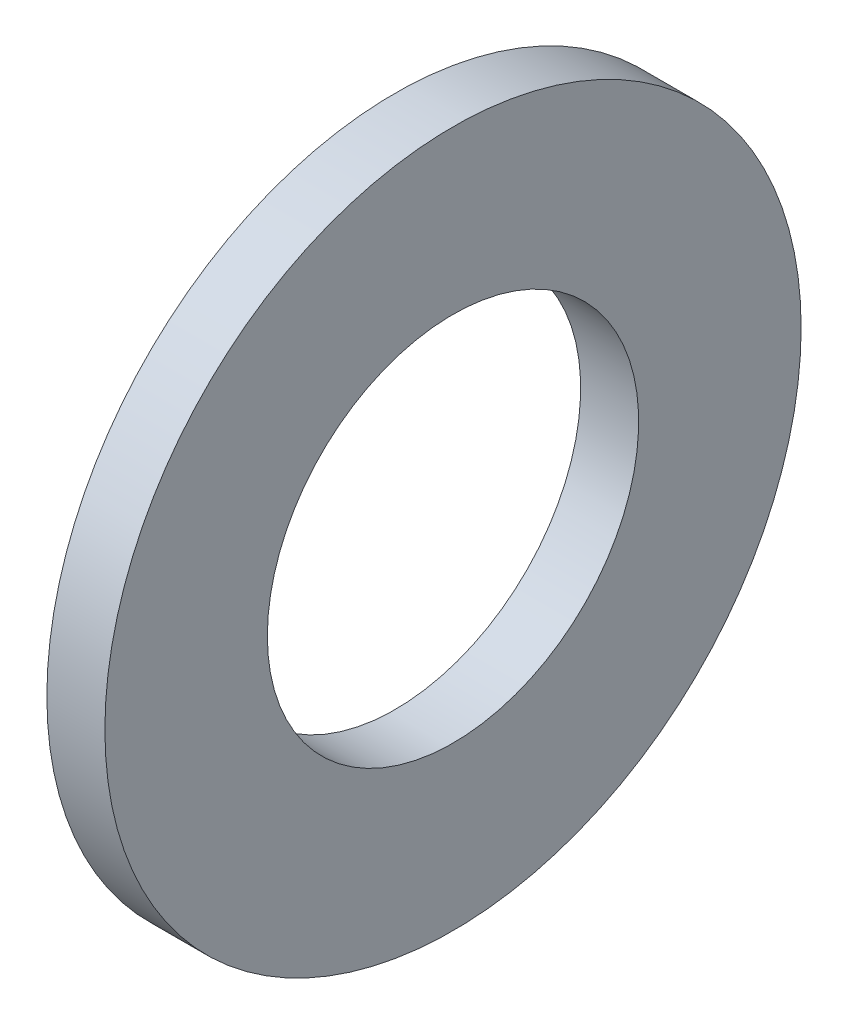
ISO-10303-21;
HEADER;
FILE_DESCRIPTION(('STEP AP214'),'2;1');
FILE_NAME('part.step','',(''),(''),'','','');
FILE_SCHEMA(('AUTOMOTIVE_DESIGN { 1 0 10303 214 1 1 1 1 }'));
ENDSEC;
DATA;
#1=APPLICATION_CONTEXT('core data for automotive mechanical design processes');
#2=APPLICATION_PROTOCOL_DEFINITION('international standard','automotive_design',2000,#1);
#3=PRODUCT_CONTEXT('',#1,'mechanical');
#4=PRODUCT('Part','Part','',(#3));
#5=PRODUCT_RELATED_PRODUCT_CATEGORY('part','',(#4));
#6=PRODUCT_DEFINITION_FORMATION('','',#4);
#7=PRODUCT_DEFINITION_CONTEXT('part definition',#1,'design');
#8=PRODUCT_DEFINITION('design','',#6,#7);
#9=PRODUCT_DEFINITION_SHAPE('','',#8);
#10=(LENGTH_UNIT() NAMED_UNIT(*) SI_UNIT(.MILLI.,.METRE.));
#11=(NAMED_UNIT(*) PLANE_ANGLE_UNIT() SI_UNIT($,.RADIAN.));
#12=(NAMED_UNIT(*) SI_UNIT($,.STERADIAN.) SOLID_ANGLE_UNIT());
#13=UNCERTAINTY_MEASURE_WITH_UNIT(LENGTH_MEASURE(1.E-05),#10,'distance_accuracy_value','');
#14=(GEOMETRIC_REPRESENTATION_CONTEXT(3) GLOBAL_UNCERTAINTY_ASSIGNED_CONTEXT((#13)) GLOBAL_UNIT_ASSIGNED_CONTEXT((#10,
#11,#12)) REPRESENTATION_CONTEXT('',''));
#15=CARTESIAN_POINT('',(0.,0.,0.));
#16=DIRECTION('',(0.,0.,1.));
#17=DIRECTION('',(1.,0.,0.));
#18=AXIS2_PLACEMENT_3D('',#15,#16,#17);
#19=CARTESIAN_POINT('',(-34.9249999999999,0.,0.));
#20=DIRECTION('',(-1.,0.,0.));
#21=DIRECTION('',(0.,0.,1.));
#22=AXIS2_PLACEMENT_3D('',#19,#20,#21);
#23=CYLINDRICAL_SURFACE('',#22,3.2);
#24=CARTESIAN_POINT('',(0.,0.,0.));
#25=DIRECTION('',(-1.,0.,0.));
#26=DIRECTION('',(0.,0.,1.));
#27=AXIS2_PLACEMENT_3D('',#24,#25,#26);
#28=CIRCLE('',#27,3.2);
#29=CARTESIAN_POINT('',(0.,0.,3.2));
#30=VERTEX_POINT('',#29);
#31=EDGE_CURVE('E10',#30,#30,#28,.T.);
#32=ORIENTED_EDGE('',*,*,#31,.F.);
#33=EDGE_LOOP('',(#32));
#34=FACE_BOUND('',#33,.T.);
#35=CARTESIAN_POINT('',(-1.,0.,0.));
#36=DIRECTION('',(-1.,0.,0.));
#37=DIRECTION('',(0.,0.,1.));
#38=AXIS2_PLACEMENT_3D('',#35,#36,#37);
#39=CIRCLE('',#38,3.2);
#40=CARTESIAN_POINT('',(-1.,0.,3.2));
#41=VERTEX_POINT('',#40);
#42=EDGE_CURVE('E45',#41,#41,#39,.T.);
#43=ORIENTED_EDGE('',*,*,#42,.T.);
#44=EDGE_LOOP('',(#43));
#45=FACE_BOUND('',#44,.T.);
#46=ADVANCED_FACE('F31',(#34,#45),#23,.F.);
#47=CARTESIAN_POINT('',(0.,3.2,0.));
#48=DIRECTION('',(-1.,0.,0.));
#49=DIRECTION('',(0.,0.,1.));
#50=AXIS2_PLACEMENT_3D('',#47,#48,#49);
#51=PLANE('',#50);
#52=CARTESIAN_POINT('',(0.,0.,0.));
#53=DIRECTION('',(-1.,0.,0.));
#54=DIRECTION('',(0.,0.,1.));
#55=AXIS2_PLACEMENT_3D('',#52,#53,#54);
#56=CIRCLE('',#55,6.);
#57=CARTESIAN_POINT('',(0.,0.,6.));
#58=VERTEX_POINT('',#57);
#59=EDGE_CURVE('E37',#58,#58,#56,.T.);
#60=ORIENTED_EDGE('',*,*,#59,.F.);
#61=EDGE_LOOP('',(#60));
#62=FACE_BOUND('',#61,.T.);
#63=ORIENTED_EDGE('',*,*,#31,.T.);
#64=EDGE_LOOP('',(#63));
#65=FACE_BOUND('',#64,.T.);
#66=ADVANCED_FACE('F60',(#62,#65),#51,.F.);
#67=CARTESIAN_POINT('',(-34.9249999999999,0.,0.));
#68=DIRECTION('',(-1.,0.,0.));
#69=DIRECTION('',(0.,0.,1.));
#70=AXIS2_PLACEMENT_3D('',#67,#68,#69);
#71=CYLINDRICAL_SURFACE('',#70,6.);
#72=CARTESIAN_POINT('',(-1.,0.,0.));
#73=DIRECTION('',(-1.,0.,0.));
#74=DIRECTION('',(0.,0.,1.));
#75=AXIS2_PLACEMENT_3D('',#72,#73,#74);
#76=CIRCLE('',#75,6.);
#77=CARTESIAN_POINT('',(-1.,0.,6.));
#78=VERTEX_POINT('',#77);
#79=EDGE_CURVE('E41',#78,#78,#76,.T.);
#80=ORIENTED_EDGE('',*,*,#79,.F.);
#81=EDGE_LOOP('',(#80));
#82=FACE_BOUND('',#81,.T.);
#83=ORIENTED_EDGE('',*,*,#59,.T.);
#84=EDGE_LOOP('',(#83));
#85=FACE_BOUND('',#84,.T.);
#86=ADVANCED_FACE('F55',(#82,#85),#71,.T.);
#87=CARTESIAN_POINT('',(-1.,6.,0.));
#88=DIRECTION('',(1.,0.,0.));
#89=DIRECTION('',(0.,0.,-1.));
#90=AXIS2_PLACEMENT_3D('',#87,#88,#89);
#91=PLANE('',#90);
#92=ORIENTED_EDGE('',*,*,#42,.F.);
#93=EDGE_LOOP('',(#92));
#94=FACE_BOUND('',#93,.T.);
#95=ORIENTED_EDGE('',*,*,#79,.T.);
#96=EDGE_LOOP('',(#95));
#97=FACE_BOUND('',#96,.T.);
#98=ADVANCED_FACE('F52',(#94,#97),#91,.F.);
#99=CLOSED_SHELL('',(#46,#66,#86,#98));
#100=MANIFOLD_SOLID_BREP('B2',#99);
#101=ADVANCED_BREP_SHAPE_REPRESENTATION('',(#18,#100),#14);
#102=SHAPE_DEFINITION_REPRESENTATION(#9,#101);
ENDSEC;
END-ISO-10303-21;
